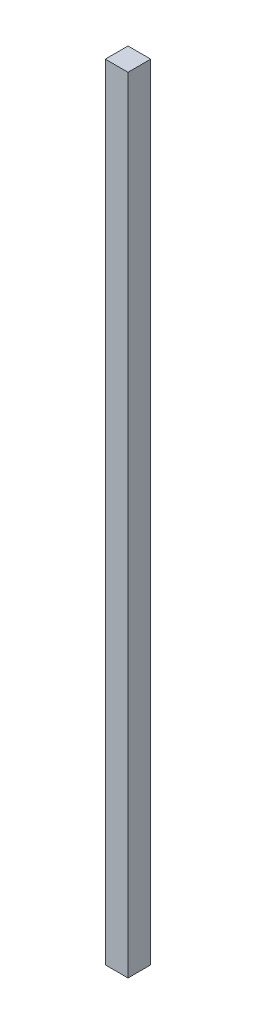
ISO-10303-21;
HEADER;
FILE_DESCRIPTION(('STEP AP214'),'2;1');
FILE_NAME('part.step','',(''),(''),'','','');
FILE_SCHEMA(('AUTOMOTIVE_DESIGN { 1 0 10303 214 1 1 1 1 }'));
ENDSEC;
DATA;
#1=APPLICATION_CONTEXT('core data for automotive mechanical design processes');
#2=APPLICATION_PROTOCOL_DEFINITION('international standard','automotive_design',2000,#1);
#3=PRODUCT_CONTEXT('',#1,'mechanical');
#4=PRODUCT('Part','Part','',(#3));
#5=PRODUCT_RELATED_PRODUCT_CATEGORY('part','',(#4));
#6=PRODUCT_DEFINITION_FORMATION('','',#4);
#7=PRODUCT_DEFINITION_CONTEXT('part definition',#1,'design');
#8=PRODUCT_DEFINITION('design','',#6,#7);
#9=PRODUCT_DEFINITION_SHAPE('','',#8);
#10=(LENGTH_UNIT() NAMED_UNIT(*) SI_UNIT(.MILLI.,.METRE.));
#11=(NAMED_UNIT(*) PLANE_ANGLE_UNIT() SI_UNIT($,.RADIAN.));
#12=(NAMED_UNIT(*) SI_UNIT($,.STERADIAN.) SOLID_ANGLE_UNIT());
#13=UNCERTAINTY_MEASURE_WITH_UNIT(LENGTH_MEASURE(1.E-05),#10,'distance_accuracy_value','');
#14=(GEOMETRIC_REPRESENTATION_CONTEXT(3) GLOBAL_UNCERTAINTY_ASSIGNED_CONTEXT((#13)) GLOBAL_UNIT_ASSIGNED_CONTEXT((#10,
#11,#12)) REPRESENTATION_CONTEXT('',''));
#15=CARTESIAN_POINT('',(0.,0.,0.));
#16=DIRECTION('',(0.,0.,1.));
#17=DIRECTION('',(1.,0.,0.));
#18=AXIS2_PLACEMENT_3D('',#15,#16,#17);
#19=CARTESIAN_POINT('',(3.175,219.075,3.175));
#20=DIRECTION('',(-1.,0.,0.));
#21=DIRECTION('',(0.,0.,1.));
#22=AXIS2_PLACEMENT_3D('',#19,#20,#21);
#23=PLANE('',#22);
#24=DIRECTION('',(0.,0.,-1.));
#25=VECTOR('',#24,1.);
#26=CARTESIAN_POINT('',(3.175,0.,3.175));
#27=LINE('',#26,#25);
#28=CARTESIAN_POINT('',(3.175,0.,3.175));
#29=VERTEX_POINT('',#28);
#30=CARTESIAN_POINT('',(3.175,0.,-3.175));
#31=VERTEX_POINT('',#30);
#32=EDGE_CURVE('E81',#29,#31,#27,.T.);
#33=ORIENTED_EDGE('',*,*,#32,.T.);
#34=DIRECTION('',(0.,-1.,0.));
#35=VECTOR('',#34,1.);
#36=CARTESIAN_POINT('',(3.175,219.075,-3.175));
#37=LINE('',#36,#35);
#38=CARTESIAN_POINT('',(3.175,219.075,-3.175));
#39=VERTEX_POINT('',#38);
#40=EDGE_CURVE('E10',#39,#31,#37,.T.);
#41=ORIENTED_EDGE('',*,*,#40,.F.);
#42=DIRECTION('',(0.,0.,-1.));
#43=VECTOR('',#42,1.);
#44=CARTESIAN_POINT('',(3.175,219.075,3.175));
#45=LINE('',#44,#43);
#46=CARTESIAN_POINT('',(3.175,219.075,3.175));
#47=VERTEX_POINT('',#46);
#48=EDGE_CURVE('E67',#47,#39,#45,.T.);
#49=ORIENTED_EDGE('',*,*,#48,.F.);
#50=DIRECTION('',(0.,-1.,0.));
#51=VECTOR('',#50,1.);
#52=CARTESIAN_POINT('',(3.175,219.075,3.175));
#53=LINE('',#52,#51);
#54=EDGE_CURVE('E75',#47,#29,#53,.T.);
#55=ORIENTED_EDGE('',*,*,#54,.T.);
#56=EDGE_LOOP('',(#33,#41,#49,#55));
#57=FACE_BOUND('',#56,.T.);
#58=ADVANCED_FACE('F16',(#57),#23,.F.);
#59=CARTESIAN_POINT('',(3.175,219.075,-3.175));
#60=DIRECTION('',(0.,0.,1.));
#61=DIRECTION('',(1.,0.,0.));
#62=AXIS2_PLACEMENT_3D('',#59,#60,#61);
#63=PLANE('',#62);
#64=DIRECTION('',(-1.,0.,0.));
#65=VECTOR('',#64,1.);
#66=CARTESIAN_POINT('',(3.175,0.,-3.175));
#67=LINE('',#66,#65);
#68=CARTESIAN_POINT('',(-3.175,0.,-3.175));
#69=VERTEX_POINT('',#68);
#70=EDGE_CURVE('E71',#31,#69,#67,.T.);
#71=ORIENTED_EDGE('',*,*,#70,.T.);
#72=DIRECTION('',(0.,-1.,0.));
#73=VECTOR('',#72,1.);
#74=CARTESIAN_POINT('',(-3.175,219.075,-3.175));
#75=LINE('',#74,#73);
#76=CARTESIAN_POINT('',(-3.175,219.075,-3.175));
#77=VERTEX_POINT('',#76);
#78=EDGE_CURVE('E24',#77,#69,#75,.T.);
#79=ORIENTED_EDGE('',*,*,#78,.F.);
#80=DIRECTION('',(-1.,0.,0.));
#81=VECTOR('',#80,1.);
#82=CARTESIAN_POINT('',(3.175,219.075,-3.175));
#83=LINE('',#82,#81);
#84=EDGE_CURVE('E62',#39,#77,#83,.T.);
#85=ORIENTED_EDGE('',*,*,#84,.F.);
#86=ORIENTED_EDGE('',*,*,#40,.T.);
#87=EDGE_LOOP('',(#71,#79,#85,#86));
#88=FACE_BOUND('',#87,.T.);
#89=ADVANCED_FACE('F70',(#88),#63,.F.);
#90=CARTESIAN_POINT('',(-3.175,219.075,-3.175));
#91=DIRECTION('',(1.,0.,0.));
#92=DIRECTION('',(0.,0.,-1.));
#93=AXIS2_PLACEMENT_3D('',#90,#91,#92);
#94=PLANE('',#93);
#95=DIRECTION('',(0.,0.,1.));
#96=VECTOR('',#95,1.);
#97=CARTESIAN_POINT('',(-3.175,0.,-3.175));
#98=LINE('',#97,#96);
#99=CARTESIAN_POINT('',(-3.175,0.,3.175));
#100=VERTEX_POINT('',#99);
#101=EDGE_CURVE('E49',#69,#100,#98,.T.);
#102=ORIENTED_EDGE('',*,*,#101,.T.);
#103=DIRECTION('',(0.,-1.,0.));
#104=VECTOR('',#103,1.);
#105=CARTESIAN_POINT('',(-3.175,219.075,3.175));
#106=LINE('',#105,#104);
#107=CARTESIAN_POINT('',(-3.175,219.075,3.175));
#108=VERTEX_POINT('',#107);
#109=EDGE_CURVE('E72',#108,#100,#106,.T.);
#110=ORIENTED_EDGE('',*,*,#109,.F.);
#111=DIRECTION('',(0.,0.,1.));
#112=VECTOR('',#111,1.);
#113=CARTESIAN_POINT('',(-3.175,219.075,-3.175));
#114=LINE('',#113,#112);
#115=EDGE_CURVE('E65',#77,#108,#114,.T.);
#116=ORIENTED_EDGE('',*,*,#115,.F.);
#117=ORIENTED_EDGE('',*,*,#78,.T.);
#118=EDGE_LOOP('',(#102,#110,#116,#117));
#119=FACE_BOUND('',#118,.T.);
#120=ADVANCED_FACE('F73',(#119),#94,.F.);
#121=CARTESIAN_POINT('',(-3.175,219.075,3.175));
#122=DIRECTION('',(0.,0.,-1.));
#123=DIRECTION('',(-1.,0.,0.));
#124=AXIS2_PLACEMENT_3D('',#121,#122,#123);
#125=PLANE('',#124);
#126=DIRECTION('',(1.,0.,0.));
#127=VECTOR('',#126,1.);
#128=CARTESIAN_POINT('',(-3.175,0.,3.175));
#129=LINE('',#128,#127);
#130=EDGE_CURVE('E55',#100,#29,#129,.T.);
#131=ORIENTED_EDGE('',*,*,#130,.T.);
#132=ORIENTED_EDGE('',*,*,#54,.F.);
#133=DIRECTION('',(1.,0.,0.));
#134=VECTOR('',#133,1.);
#135=CARTESIAN_POINT('',(-3.175,219.075,3.175));
#136=LINE('',#135,#134);
#137=EDGE_CURVE('E32',#108,#47,#136,.T.);
#138=ORIENTED_EDGE('',*,*,#137,.F.);
#139=ORIENTED_EDGE('',*,*,#109,.T.);
#140=EDGE_LOOP('',(#131,#132,#138,#139));
#141=FACE_BOUND('',#140,.T.);
#142=ADVANCED_FACE('F90',(#141),#125,.F.);
#143=CARTESIAN_POINT('',(0.,219.075,0.));
#144=DIRECTION('',(0.,1.,0.));
#145=DIRECTION('',(0.,0.,1.));
#146=AXIS2_PLACEMENT_3D('',#143,#144,#145);
#147=PLANE('',#146);
#148=ORIENTED_EDGE('',*,*,#48,.T.);
#149=ORIENTED_EDGE('',*,*,#84,.T.);
#150=ORIENTED_EDGE('',*,*,#115,.T.);
#151=ORIENTED_EDGE('',*,*,#137,.T.);
#152=EDGE_LOOP('',(#148,#149,#150,#151));
#153=FACE_BOUND('',#152,.T.);
#154=ADVANCED_FACE('F63',(#153),#147,.T.);
#155=CARTESIAN_POINT('',(0.,0.,0.));
#156=DIRECTION('',(0.,1.,0.));
#157=DIRECTION('',(0.,0.,1.));
#158=AXIS2_PLACEMENT_3D('',#155,#156,#157);
#159=PLANE('',#158);
#160=ORIENTED_EDGE('',*,*,#32,.F.);
#161=ORIENTED_EDGE('',*,*,#130,.F.);
#162=ORIENTED_EDGE('',*,*,#101,.F.);
#163=ORIENTED_EDGE('',*,*,#70,.F.);
#164=EDGE_LOOP('',(#160,#161,#162,#163));
#165=FACE_BOUND('',#164,.T.);
#166=ADVANCED_FACE('F93',(#165),#159,.F.);
#167=CLOSED_SHELL('',(#58,#89,#120,#142,#154,#166));
#168=MANIFOLD_SOLID_BREP('B1',#167);
#169=ADVANCED_BREP_SHAPE_REPRESENTATION('',(#18,#168),#14);
#170=SHAPE_DEFINITION_REPRESENTATION(#9,#169);
ENDSEC;
END-ISO-10303-21;
